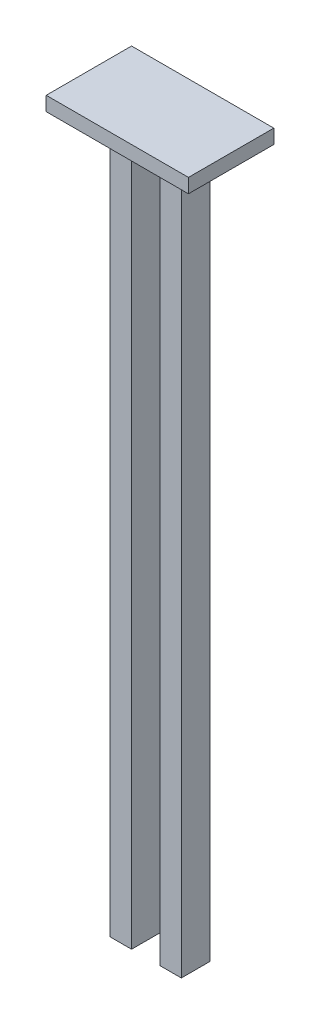
ISO-10303-21;
HEADER;
FILE_DESCRIPTION(('STEP AP214'),'2;1');
FILE_NAME('part.step','',(''),(''),'','','');
FILE_SCHEMA(('AUTOMOTIVE_DESIGN { 1 0 10303 214 1 1 1 1 }'));
ENDSEC;
DATA;
#1=APPLICATION_CONTEXT('core data for automotive mechanical design processes');
#2=APPLICATION_PROTOCOL_DEFINITION('international standard','automotive_design',2000,#1);
#3=PRODUCT_CONTEXT('',#1,'mechanical');
#4=PRODUCT('Part','Part','',(#3));
#5=PRODUCT_RELATED_PRODUCT_CATEGORY('part','',(#4));
#6=PRODUCT_DEFINITION_FORMATION('','',#4);
#7=PRODUCT_DEFINITION_CONTEXT('part definition',#1,'design');
#8=PRODUCT_DEFINITION('design','',#6,#7);
#9=PRODUCT_DEFINITION_SHAPE('','',#8);
#10=(LENGTH_UNIT() NAMED_UNIT(*) SI_UNIT(.MILLI.,.METRE.));
#11=(NAMED_UNIT(*) PLANE_ANGLE_UNIT() SI_UNIT($,.RADIAN.));
#12=(NAMED_UNIT(*) SI_UNIT($,.STERADIAN.) SOLID_ANGLE_UNIT());
#13=UNCERTAINTY_MEASURE_WITH_UNIT(LENGTH_MEASURE(1.E-05),#10,'distance_accuracy_value','');
#14=(GEOMETRIC_REPRESENTATION_CONTEXT(3) GLOBAL_UNCERTAINTY_ASSIGNED_CONTEXT((#13)) GLOBAL_UNIT_ASSIGNED_CONTEXT((#10,
#11,#12)) REPRESENTATION_CONTEXT('',''));
#15=CARTESIAN_POINT('',(0.,0.,0.));
#16=DIRECTION('',(0.,0.,1.));
#17=DIRECTION('',(1.,0.,0.));
#18=AXIS2_PLACEMENT_3D('',#15,#16,#17);
#19=CARTESIAN_POINT('',(-5.,1.,-3.));
#20=DIRECTION('',(1.,0.,0.));
#21=DIRECTION('',(0.,0.,-1.));
#22=AXIS2_PLACEMENT_3D('',#19,#20,#21);
#23=PLANE('',#22);
#24=DIRECTION('',(0.,0.,1.));
#25=VECTOR('',#24,1.);
#26=CARTESIAN_POINT('',(-5.,0.,-3.));
#27=LINE('',#26,#25);
#28=CARTESIAN_POINT('',(-5.,0.,-3.));
#29=VERTEX_POINT('',#28);
#30=CARTESIAN_POINT('',(-5.,0.,3.));
#31=VERTEX_POINT('',#30);
#32=EDGE_CURVE('E197',#29,#31,#27,.T.);
#33=ORIENTED_EDGE('',*,*,#32,.T.);
#34=DIRECTION('',(0.,-1.,0.));
#35=VECTOR('',#34,1.);
#36=CARTESIAN_POINT('',(-5.,1.,3.));
#37=LINE('',#36,#35);
#38=CARTESIAN_POINT('',(-5.,1.,3.));
#39=VERTEX_POINT('',#38);
#40=EDGE_CURVE('E11',#39,#31,#37,.T.);
#41=ORIENTED_EDGE('',*,*,#40,.F.);
#42=DIRECTION('',(0.,0.,1.));
#43=VECTOR('',#42,1.);
#44=CARTESIAN_POINT('',(-5.,1.,-3.));
#45=LINE('',#44,#43);
#46=CARTESIAN_POINT('',(-5.,1.,-3.));
#47=VERTEX_POINT('',#46);
#48=EDGE_CURVE('E198',#47,#39,#45,.T.);
#49=ORIENTED_EDGE('',*,*,#48,.F.);
#50=DIRECTION('',(0.,-1.,0.));
#51=VECTOR('',#50,1.);
#52=CARTESIAN_POINT('',(-5.,1.,-3.));
#53=LINE('',#52,#51);
#54=EDGE_CURVE('E208',#47,#29,#53,.T.);
#55=ORIENTED_EDGE('',*,*,#54,.T.);
#56=EDGE_LOOP('',(#33,#41,#49,#55));
#57=FACE_BOUND('',#56,.T.);
#58=ADVANCED_FACE('F39',(#57),#23,.F.);
#59=CARTESIAN_POINT('',(-5.,1.,3.));
#60=DIRECTION('',(0.,0.,-1.));
#61=DIRECTION('',(-1.,0.,0.));
#62=AXIS2_PLACEMENT_3D('',#59,#60,#61);
#63=PLANE('',#62);
#64=DIRECTION('',(1.,0.,0.));
#65=VECTOR('',#64,1.);
#66=CARTESIAN_POINT('',(-5.,0.,3.));
#67=LINE('',#66,#65);
#68=CARTESIAN_POINT('',(5.,0.,3.));
#69=VERTEX_POINT('',#68);
#70=EDGE_CURVE('E211',#31,#69,#67,.T.);
#71=ORIENTED_EDGE('',*,*,#70,.T.);
#72=DIRECTION('',(0.,-1.,0.));
#73=VECTOR('',#72,1.);
#74=CARTESIAN_POINT('',(5.,1.,3.));
#75=LINE('',#74,#73);
#76=CARTESIAN_POINT('',(5.,1.,3.));
#77=VERTEX_POINT('',#76);
#78=EDGE_CURVE('E46',#77,#69,#75,.T.);
#79=ORIENTED_EDGE('',*,*,#78,.F.);
#80=DIRECTION('',(1.,0.,0.));
#81=VECTOR('',#80,1.);
#82=CARTESIAN_POINT('',(-5.,1.,3.));
#83=LINE('',#82,#81);
#84=EDGE_CURVE('E201',#39,#77,#83,.T.);
#85=ORIENTED_EDGE('',*,*,#84,.F.);
#86=ORIENTED_EDGE('',*,*,#40,.T.);
#87=EDGE_LOOP('',(#71,#79,#85,#86));
#88=FACE_BOUND('',#87,.T.);
#89=ADVANCED_FACE('F241',(#88),#63,.F.);
#90=CARTESIAN_POINT('',(5.,1.,-3.));
#91=DIRECTION('',(-1.,0.,0.));
#92=DIRECTION('',(0.,0.,1.));
#93=AXIS2_PLACEMENT_3D('',#90,#91,#92);
#94=PLANE('',#93);
#95=DIRECTION('',(0.,0.,-1.));
#96=VECTOR('',#95,1.);
#97=CARTESIAN_POINT('',(5.,0.,-3.));
#98=LINE('',#97,#96);
#99=CARTESIAN_POINT('',(5.,0.,-3.));
#100=VERTEX_POINT('',#99);
#101=EDGE_CURVE('E213',#69,#100,#98,.T.);
#102=ORIENTED_EDGE('',*,*,#101,.T.);
#103=DIRECTION('',(0.,-1.,0.));
#104=VECTOR('',#103,1.);
#105=CARTESIAN_POINT('',(5.,1.,-3.));
#106=LINE('',#105,#104);
#107=CARTESIAN_POINT('',(5.,1.,-3.));
#108=VERTEX_POINT('',#107);
#109=EDGE_CURVE('E218',#108,#100,#106,.T.);
#110=ORIENTED_EDGE('',*,*,#109,.F.);
#111=DIRECTION('',(0.,0.,-1.));
#112=VECTOR('',#111,1.);
#113=CARTESIAN_POINT('',(5.,1.,-3.));
#114=LINE('',#113,#112);
#115=EDGE_CURVE('E204',#77,#108,#114,.T.);
#116=ORIENTED_EDGE('',*,*,#115,.F.);
#117=ORIENTED_EDGE('',*,*,#78,.T.);
#118=EDGE_LOOP('',(#102,#110,#116,#117));
#119=FACE_BOUND('',#118,.T.);
#120=ADVANCED_FACE('F225',(#119),#94,.F.);
#121=CARTESIAN_POINT('',(-5.,1.,-3.));
#122=DIRECTION('',(0.,0.,1.));
#123=DIRECTION('',(1.,0.,0.));
#124=AXIS2_PLACEMENT_3D('',#121,#122,#123);
#125=PLANE('',#124);
#126=DIRECTION('',(-1.,0.,0.));
#127=VECTOR('',#126,1.);
#128=CARTESIAN_POINT('',(-5.,0.,-3.));
#129=LINE('',#128,#127);
#130=EDGE_CURVE('E202',#100,#29,#129,.T.);
#131=ORIENTED_EDGE('',*,*,#130,.T.);
#132=ORIENTED_EDGE('',*,*,#54,.F.);
#133=DIRECTION('',(-1.,0.,0.));
#134=VECTOR('',#133,1.);
#135=CARTESIAN_POINT('',(-5.,1.,-3.));
#136=LINE('',#135,#134);
#137=EDGE_CURVE('E206',#108,#47,#136,.T.);
#138=ORIENTED_EDGE('',*,*,#137,.F.);
#139=ORIENTED_EDGE('',*,*,#109,.T.);
#140=EDGE_LOOP('',(#131,#132,#138,#139));
#141=FACE_BOUND('',#140,.T.);
#142=ADVANCED_FACE('F234',(#141),#125,.F.);
#143=CARTESIAN_POINT('',(0.,1.,0.));
#144=DIRECTION('',(0.,1.,0.));
#145=DIRECTION('',(0.,0.,1.));
#146=AXIS2_PLACEMENT_3D('',#143,#144,#145);
#147=PLANE('',#146);
#148=ORIENTED_EDGE('',*,*,#48,.T.);
#149=ORIENTED_EDGE('',*,*,#84,.T.);
#150=ORIENTED_EDGE('',*,*,#115,.T.);
#151=ORIENTED_EDGE('',*,*,#137,.T.);
#152=EDGE_LOOP('',(#148,#149,#150,#151));
#153=FACE_BOUND('',#152,.T.);
#154=ADVANCED_FACE('F240',(#153),#147,.T.);
#155=CARTESIAN_POINT('',(0.,0.,0.));
#156=DIRECTION('',(0.,1.,0.));
#157=DIRECTION('',(0.,0.,1.));
#158=AXIS2_PLACEMENT_3D('',#155,#156,#157);
#159=PLANE('',#158);
#160=DIRECTION('',(0.,0.,-1.));
#161=VECTOR('',#160,1.);
#162=CARTESIAN_POINT('',(1.,0.,0.));
#163=LINE('',#162,#161);
#164=CARTESIAN_POINT('',(1.,0.,1.));
#165=VERTEX_POINT('',#164);
#166=CARTESIAN_POINT('',(1.,0.,-1.));
#167=VERTEX_POINT('',#166);
#168=EDGE_CURVE('E161',#165,#167,#163,.T.);
#169=ORIENTED_EDGE('',*,*,#168,.F.);
#170=DIRECTION('',(1.,0.,0.));
#171=VECTOR('',#170,1.);
#172=CARTESIAN_POINT('',(0.,0.,1.));
#173=LINE('',#172,#171);
#174=CARTESIAN_POINT('',(2.5,0.,1.));
#175=VERTEX_POINT('',#174);
#176=EDGE_CURVE('E136',#165,#175,#173,.T.);
#177=ORIENTED_EDGE('',*,*,#176,.T.);
#178=DIRECTION('',(0.,0.,-1.));
#179=VECTOR('',#178,1.);
#180=CARTESIAN_POINT('',(2.5,0.,0.));
#181=LINE('',#180,#179);
#182=CARTESIAN_POINT('',(2.5,0.,-1.));
#183=VERTEX_POINT('',#182);
#184=EDGE_CURVE('E152',#175,#183,#181,.T.);
#185=ORIENTED_EDGE('',*,*,#184,.T.);
#186=DIRECTION('',(1.,0.,0.));
#187=VECTOR('',#186,1.);
#188=CARTESIAN_POINT('',(0.,0.,-1.));
#189=LINE('',#188,#187);
#190=EDGE_CURVE('E53',#167,#183,#189,.T.);
#191=ORIENTED_EDGE('',*,*,#190,.F.);
#192=EDGE_LOOP('',(#169,#177,#185,#191));
#193=FACE_BOUND('',#192,.T.);
#194=DIRECTION('',(1.,0.,0.));
#195=VECTOR('',#194,1.);
#196=CARTESIAN_POINT('',(0.,0.,1.));
#197=LINE('',#196,#195);
#198=CARTESIAN_POINT('',(-2.5,0.,1.));
#199=VERTEX_POINT('',#198);
#200=CARTESIAN_POINT('',(-1.,0.,1.));
#201=VERTEX_POINT('',#200);
#202=EDGE_CURVE('E61',#199,#201,#197,.T.);
#203=ORIENTED_EDGE('',*,*,#202,.T.);
#204=DIRECTION('',(0.,0.,-1.));
#205=VECTOR('',#204,1.);
#206=CARTESIAN_POINT('',(-1.,0.,0.));
#207=LINE('',#206,#205);
#208=CARTESIAN_POINT('',(-1.,0.,-1.));
#209=VERTEX_POINT('',#208);
#210=EDGE_CURVE('E139',#201,#209,#207,.T.);
#211=ORIENTED_EDGE('',*,*,#210,.T.);
#212=DIRECTION('',(1.,0.,0.));
#213=VECTOR('',#212,1.);
#214=CARTESIAN_POINT('',(0.,0.,-1.));
#215=LINE('',#214,#213);
#216=CARTESIAN_POINT('',(-2.5,0.,-1.));
#217=VERTEX_POINT('',#216);
#218=EDGE_CURVE('E172',#217,#209,#215,.T.);
#219=ORIENTED_EDGE('',*,*,#218,.F.);
#220=DIRECTION('',(0.,0.,-1.));
#221=VECTOR('',#220,1.);
#222=CARTESIAN_POINT('',(-2.5,0.,0.));
#223=LINE('',#222,#221);
#224=EDGE_CURVE('E182',#199,#217,#223,.T.);
#225=ORIENTED_EDGE('',*,*,#224,.F.);
#226=EDGE_LOOP('',(#203,#211,#219,#225));
#227=FACE_BOUND('',#226,.T.);
#228=ORIENTED_EDGE('',*,*,#32,.F.);
#229=ORIENTED_EDGE('',*,*,#130,.F.);
#230=ORIENTED_EDGE('',*,*,#101,.F.);
#231=ORIENTED_EDGE('',*,*,#70,.F.);
#232=EDGE_LOOP('',(#228,#229,#230,#231));
#233=FACE_BOUND('',#232,.T.);
#234=ADVANCED_FACE('F231',(#193,#227,#233),#159,.F.);
#235=CARTESIAN_POINT('',(-1.,-50.,0.));
#236=DIRECTION('',(1.,0.,0.));
#237=DIRECTION('',(0.,0.,-1.));
#238=AXIS2_PLACEMENT_3D('',#235,#236,#237);
#239=PLANE('',#238);
#240=ORIENTED_EDGE('',*,*,#210,.F.);
#241=DIRECTION('',(0.,1.,0.));
#242=VECTOR('',#241,1.);
#243=CARTESIAN_POINT('',(-1.,-50.,1.));
#244=LINE('',#243,#242);
#245=CARTESIAN_POINT('',(-1.,-50.,1.));
#246=VERTEX_POINT('',#245);
#247=EDGE_CURVE('E195',#246,#201,#244,.T.);
#248=ORIENTED_EDGE('',*,*,#247,.F.);
#249=DIRECTION('',(0.,0.,-1.));
#250=VECTOR('',#249,1.);
#251=CARTESIAN_POINT('',(-1.,-50.,0.));
#252=LINE('',#251,#250);
#253=CARTESIAN_POINT('',(-1.,-50.,-1.));
#254=VERTEX_POINT('',#253);
#255=EDGE_CURVE('E168',#246,#254,#252,.T.);
#256=ORIENTED_EDGE('',*,*,#255,.T.);
#257=DIRECTION('',(0.,1.,0.));
#258=VECTOR('',#257,1.);
#259=CARTESIAN_POINT('',(-1.,-50.,-1.));
#260=LINE('',#259,#258);
#261=EDGE_CURVE('E179',#254,#209,#260,.T.);
#262=ORIENTED_EDGE('',*,*,#261,.T.);
#263=EDGE_LOOP('',(#240,#248,#256,#262));
#264=FACE_BOUND('',#263,.T.);
#265=ADVANCED_FACE('F253',(#264),#239,.T.);
#266=CARTESIAN_POINT('',(0.,-50.,1.));
#267=DIRECTION('',(0.,0.,1.));
#268=DIRECTION('',(1.,0.,0.));
#269=AXIS2_PLACEMENT_3D('',#266,#267,#268);
#270=PLANE('',#269);
#271=ORIENTED_EDGE('',*,*,#202,.F.);
#272=DIRECTION('',(0.,1.,0.));
#273=VECTOR('',#272,1.);
#274=CARTESIAN_POINT('',(-2.5,-50.,1.));
#275=LINE('',#274,#273);
#276=CARTESIAN_POINT('',(-2.5,-50.,1.));
#277=VERTEX_POINT('',#276);
#278=EDGE_CURVE('E192',#277,#199,#275,.T.);
#279=ORIENTED_EDGE('',*,*,#278,.F.);
#280=DIRECTION('',(1.,0.,0.));
#281=VECTOR('',#280,1.);
#282=CARTESIAN_POINT('',(0.,-50.,1.));
#283=LINE('',#282,#281);
#284=EDGE_CURVE('E171',#277,#246,#283,.T.);
#285=ORIENTED_EDGE('',*,*,#284,.T.);
#286=ORIENTED_EDGE('',*,*,#247,.T.);
#287=EDGE_LOOP('',(#271,#279,#285,#286));
#288=FACE_BOUND('',#287,.T.);
#289=ADVANCED_FACE('F259',(#288),#270,.T.);
#290=CARTESIAN_POINT('',(-2.5,-50.,0.));
#291=DIRECTION('',(1.,0.,0.));
#292=DIRECTION('',(0.,0.,-1.));
#293=AXIS2_PLACEMENT_3D('',#290,#291,#292);
#294=PLANE('',#293);
#295=ORIENTED_EDGE('',*,*,#224,.T.);
#296=DIRECTION('',(0.,1.,0.));
#297=VECTOR('',#296,1.);
#298=CARTESIAN_POINT('',(-2.5,-50.,-1.));
#299=LINE('',#298,#297);
#300=CARTESIAN_POINT('',(-2.5,-50.,-1.));
#301=VERTEX_POINT('',#300);
#302=EDGE_CURVE('E189',#301,#217,#299,.T.);
#303=ORIENTED_EDGE('',*,*,#302,.F.);
#304=DIRECTION('',(0.,0.,-1.));
#305=VECTOR('',#304,1.);
#306=CARTESIAN_POINT('',(-2.5,-50.,0.));
#307=LINE('',#306,#305);
#308=EDGE_CURVE('E175',#277,#301,#307,.T.);
#309=ORIENTED_EDGE('',*,*,#308,.F.);
#310=ORIENTED_EDGE('',*,*,#278,.T.);
#311=EDGE_LOOP('',(#295,#303,#309,#310));
#312=FACE_BOUND('',#311,.T.);
#313=ADVANCED_FACE('F263',(#312),#294,.F.);
#314=CARTESIAN_POINT('',(0.,-50.,-1.));
#315=DIRECTION('',(0.,0.,1.));
#316=DIRECTION('',(1.,0.,0.));
#317=AXIS2_PLACEMENT_3D('',#314,#315,#316);
#318=PLANE('',#317);
#319=ORIENTED_EDGE('',*,*,#218,.T.);
#320=ORIENTED_EDGE('',*,*,#261,.F.);
#321=DIRECTION('',(1.,0.,0.));
#322=VECTOR('',#321,1.);
#323=CARTESIAN_POINT('',(0.,-50.,-1.));
#324=LINE('',#323,#322);
#325=EDGE_CURVE('E177',#301,#254,#324,.T.);
#326=ORIENTED_EDGE('',*,*,#325,.F.);
#327=ORIENTED_EDGE('',*,*,#302,.T.);
#328=EDGE_LOOP('',(#319,#320,#326,#327));
#329=FACE_BOUND('',#328,.T.);
#330=ADVANCED_FACE('F267',(#329),#318,.F.);
#331=CARTESIAN_POINT('',(0.,-50.,0.));
#332=DIRECTION('',(0.,-1.,0.));
#333=DIRECTION('',(0.,0.,-1.));
#334=AXIS2_PLACEMENT_3D('',#331,#332,#333);
#335=PLANE('',#334);
#336=ORIENTED_EDGE('',*,*,#255,.F.);
#337=ORIENTED_EDGE('',*,*,#284,.F.);
#338=ORIENTED_EDGE('',*,*,#308,.T.);
#339=ORIENTED_EDGE('',*,*,#325,.T.);
#340=EDGE_LOOP('',(#336,#337,#338,#339));
#341=FACE_BOUND('',#340,.T.);
#342=ADVANCED_FACE('F271',(#341),#335,.T.);
#343=CARTESIAN_POINT('',(0.,-50.,1.));
#344=DIRECTION('',(0.,0.,1.));
#345=DIRECTION('',(1.,0.,0.));
#346=AXIS2_PLACEMENT_3D('',#343,#344,#345);
#347=PLANE('',#346);
#348=ORIENTED_EDGE('',*,*,#176,.F.);
#349=DIRECTION('',(0.,1.,0.));
#350=VECTOR('',#349,1.);
#351=CARTESIAN_POINT('',(1.,-50.,1.));
#352=LINE('',#351,#350);
#353=CARTESIAN_POINT('',(1.,-50.,1.));
#354=VERTEX_POINT('',#353);
#355=EDGE_CURVE('E129',#354,#165,#352,.T.);
#356=ORIENTED_EDGE('',*,*,#355,.F.);
#357=DIRECTION('',(1.,0.,0.));
#358=VECTOR('',#357,1.);
#359=CARTESIAN_POINT('',(0.,-50.,1.));
#360=LINE('',#359,#358);
#361=CARTESIAN_POINT('',(2.5,-50.,1.));
#362=VERTEX_POINT('',#361);
#363=EDGE_CURVE('E133',#354,#362,#360,.T.);
#364=ORIENTED_EDGE('',*,*,#363,.T.);
#365=DIRECTION('',(0.,1.,0.));
#366=VECTOR('',#365,1.);
#367=CARTESIAN_POINT('',(2.5,-50.,1.));
#368=LINE('',#367,#366);
#369=EDGE_CURVE('E159',#362,#175,#368,.T.);
#370=ORIENTED_EDGE('',*,*,#369,.T.);
#371=EDGE_LOOP('',(#348,#356,#364,#370));
#372=FACE_BOUND('',#371,.T.);
#373=ADVANCED_FACE('F131',(#372),#347,.T.);
#374=CARTESIAN_POINT('',(1.,-50.,0.));
#375=DIRECTION('',(1.,0.,0.));
#376=DIRECTION('',(0.,0.,-1.));
#377=AXIS2_PLACEMENT_3D('',#374,#375,#376);
#378=PLANE('',#377);
#379=ORIENTED_EDGE('',*,*,#168,.T.);
#380=DIRECTION('',(0.,1.,0.));
#381=VECTOR('',#380,1.);
#382=CARTESIAN_POINT('',(1.,-50.,-1.));
#383=LINE('',#382,#381);
#384=CARTESIAN_POINT('',(1.,-50.,-1.));
#385=VERTEX_POINT('',#384);
#386=EDGE_CURVE('E140',#385,#167,#383,.T.);
#387=ORIENTED_EDGE('',*,*,#386,.F.);
#388=DIRECTION('',(0.,0.,-1.));
#389=VECTOR('',#388,1.);
#390=CARTESIAN_POINT('',(1.,-50.,0.));
#391=LINE('',#390,#389);
#392=EDGE_CURVE('E143',#354,#385,#391,.T.);
#393=ORIENTED_EDGE('',*,*,#392,.F.);
#394=ORIENTED_EDGE('',*,*,#355,.T.);
#395=EDGE_LOOP('',(#379,#387,#393,#394));
#396=FACE_BOUND('',#395,.T.);
#397=ADVANCED_FACE('F144',(#396),#378,.F.);
#398=CARTESIAN_POINT('',(0.,-50.,-1.));
#399=DIRECTION('',(0.,0.,1.));
#400=DIRECTION('',(1.,0.,0.));
#401=AXIS2_PLACEMENT_3D('',#398,#399,#400);
#402=PLANE('',#401);
#403=ORIENTED_EDGE('',*,*,#190,.T.);
#404=DIRECTION('',(0.,1.,0.));
#405=VECTOR('',#404,1.);
#406=CARTESIAN_POINT('',(2.5,-50.,-1.));
#407=LINE('',#406,#405);
#408=CARTESIAN_POINT('',(2.5,-50.,-1.));
#409=VERTEX_POINT('',#408);
#410=EDGE_CURVE('E165',#409,#183,#407,.T.);
#411=ORIENTED_EDGE('',*,*,#410,.F.);
#412=DIRECTION('',(1.,0.,0.));
#413=VECTOR('',#412,1.);
#414=CARTESIAN_POINT('',(0.,-50.,-1.));
#415=LINE('',#414,#413);
#416=EDGE_CURVE('E147',#385,#409,#415,.T.);
#417=ORIENTED_EDGE('',*,*,#416,.F.);
#418=ORIENTED_EDGE('',*,*,#386,.T.);
#419=EDGE_LOOP('',(#403,#411,#417,#418));
#420=FACE_BOUND('',#419,.T.);
#421=ADVANCED_FACE('F280',(#420),#402,.F.);
#422=CARTESIAN_POINT('',(2.5,-50.,0.));
#423=DIRECTION('',(1.,0.,0.));
#424=DIRECTION('',(0.,0.,-1.));
#425=AXIS2_PLACEMENT_3D('',#422,#423,#424);
#426=PLANE('',#425);
#427=ORIENTED_EDGE('',*,*,#184,.F.);
#428=ORIENTED_EDGE('',*,*,#369,.F.);
#429=DIRECTION('',(0.,0.,-1.));
#430=VECTOR('',#429,1.);
#431=CARTESIAN_POINT('',(2.5,-50.,0.));
#432=LINE('',#431,#430);
#433=EDGE_CURVE('E151',#362,#409,#432,.T.);
#434=ORIENTED_EDGE('',*,*,#433,.T.);
#435=ORIENTED_EDGE('',*,*,#410,.T.);
#436=EDGE_LOOP('',(#427,#428,#434,#435));
#437=FACE_BOUND('',#436,.T.);
#438=ADVANCED_FACE('F283',(#437),#426,.T.);
#439=CARTESIAN_POINT('',(0.,-50.,0.));
#440=DIRECTION('',(0.,-1.,0.));
#441=DIRECTION('',(0.,0.,-1.));
#442=AXIS2_PLACEMENT_3D('',#439,#440,#441);
#443=PLANE('',#442);
#444=ORIENTED_EDGE('',*,*,#363,.F.);
#445=ORIENTED_EDGE('',*,*,#392,.T.);
#446=ORIENTED_EDGE('',*,*,#416,.T.);
#447=ORIENTED_EDGE('',*,*,#433,.F.);
#448=EDGE_LOOP('',(#444,#445,#446,#447));
#449=FACE_BOUND('',#448,.T.);
#450=ADVANCED_FACE('F149',(#449),#443,.T.);
#451=CLOSED_SHELL('',(#58,#89,#120,#142,#154,#234,#265,#289,#313,#330,#342,#373,#397,#421,#438,#450));
#452=MANIFOLD_SOLID_BREP('B2',#451);
#453=ADVANCED_BREP_SHAPE_REPRESENTATION('',(#18,#452),#14);
#454=SHAPE_DEFINITION_REPRESENTATION(#9,#453);
ENDSEC;
END-ISO-10303-21;
